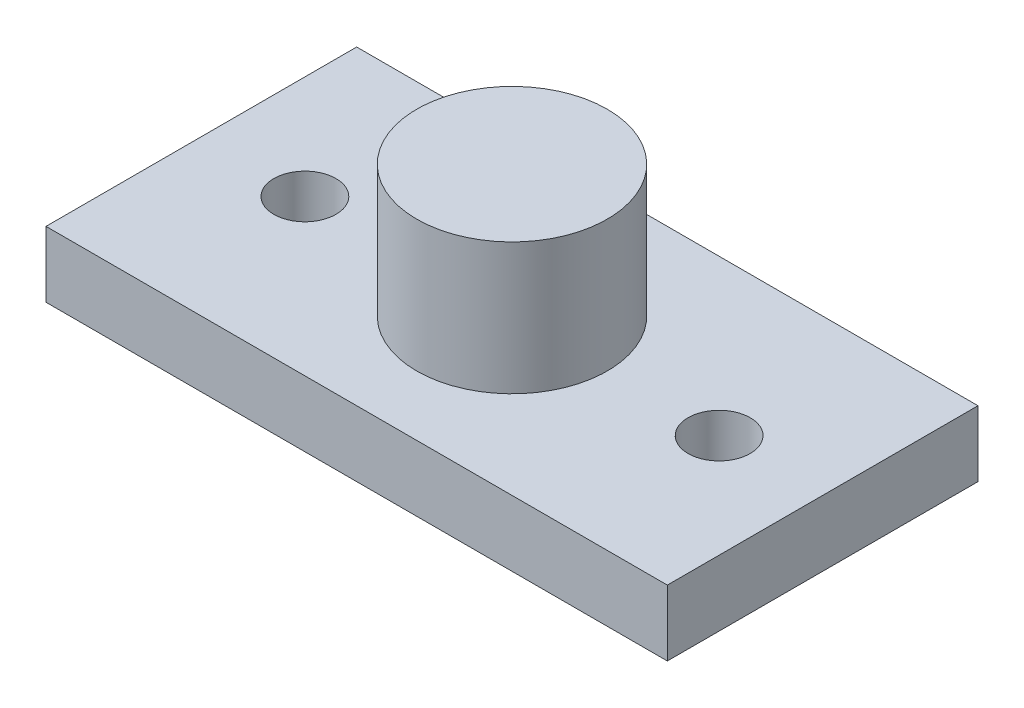
ISO-10303-21;
HEADER;
FILE_DESCRIPTION(('STEP AP214'),'2;1');
FILE_NAME('part.step','',(''),(''),'','','');
FILE_SCHEMA(('AUTOMOTIVE_DESIGN { 1 0 10303 214 1 1 1 1 }'));
ENDSEC;
DATA;
#1=APPLICATION_CONTEXT('core data for automotive mechanical design processes');
#2=APPLICATION_PROTOCOL_DEFINITION('international standard','automotive_design',2000,#1);
#3=PRODUCT_CONTEXT('',#1,'mechanical');
#4=PRODUCT('Part','Part','',(#3));
#5=PRODUCT_RELATED_PRODUCT_CATEGORY('part','',(#4));
#6=PRODUCT_DEFINITION_FORMATION('','',#4);
#7=PRODUCT_DEFINITION_CONTEXT('part definition',#1,'design');
#8=PRODUCT_DEFINITION('design','',#6,#7);
#9=PRODUCT_DEFINITION_SHAPE('','',#8);
#10=(LENGTH_UNIT() NAMED_UNIT(*) SI_UNIT(.MILLI.,.METRE.));
#11=(NAMED_UNIT(*) PLANE_ANGLE_UNIT() SI_UNIT($,.RADIAN.));
#12=(NAMED_UNIT(*) SI_UNIT($,.STERADIAN.) SOLID_ANGLE_UNIT());
#13=UNCERTAINTY_MEASURE_WITH_UNIT(LENGTH_MEASURE(1.E-05),#10,'distance_accuracy_value','');
#14=(GEOMETRIC_REPRESENTATION_CONTEXT(3) GLOBAL_UNCERTAINTY_ASSIGNED_CONTEXT((#13)) GLOBAL_UNIT_ASSIGNED_CONTEXT((#10,
#11,#12)) REPRESENTATION_CONTEXT('',''));
#15=CARTESIAN_POINT('',(0.,0.,0.));
#16=DIRECTION('',(0.,0.,1.));
#17=DIRECTION('',(1.,0.,0.));
#18=AXIS2_PLACEMENT_3D('',#15,#16,#17);
#19=CARTESIAN_POINT('',(15.,9.525,-7.5));
#20=DIRECTION('',(0.,-1.,0.));
#21=DIRECTION('',(0.,0.,-1.));
#22=AXIS2_PLACEMENT_3D('',#19,#20,#21);
#23=CYLINDRICAL_SURFACE('',#22,4.6);
#24=CARTESIAN_POINT('',(15.,3.175,-7.5));
#25=DIRECTION('',(0.,1.,0.));
#26=DIRECTION('',(0.,0.,1.));
#27=AXIS2_PLACEMENT_3D('',#24,#25,#26);
#28=CIRCLE('',#27,4.6);
#29=CARTESIAN_POINT('',(15.,3.175,-12.1));
#30=VERTEX_POINT('',#29);
#31=EDGE_CURVE('E142',#30,#30,#28,.T.);
#32=CARTESIAN_POINT('',(15.,9.525,-7.5));
#33=DIRECTION('',(0.,1.,0.));
#34=DIRECTION('',(0.,0.,1.));
#35=AXIS2_PLACEMENT_3D('',#32,#33,#34);
#36=CIRCLE('',#35,4.6);
#37=CARTESIAN_POINT('',(15.,9.525,-12.1));
#38=VERTEX_POINT('',#37);
#39=EDGE_CURVE('E11',#38,#38,#36,.T.);
#40=CARTESIAN_POINT('',(15.,3.175,-12.1));
#41=CARTESIAN_POINT('',(15.,3.24114583333333,-12.1));
#42=CARTESIAN_POINT('',(15.,3.30729166666667,-12.1));
#43=CARTESIAN_POINT('',(15.,3.43958333333333,-12.1));
#44=CARTESIAN_POINT('',(15.,3.50572916666667,-12.1));
#45=CARTESIAN_POINT('',(15.,3.63802083333333,-12.1));
#46=CARTESIAN_POINT('',(15.,3.70416666666667,-12.1));
#47=CARTESIAN_POINT('',(15.,3.83645833333333,-12.1));
#48=CARTESIAN_POINT('',(15.,3.90260416666667,-12.1));
#49=CARTESIAN_POINT('',(15.,4.03489583333333,-12.1));
#50=CARTESIAN_POINT('',(15.,4.10104166666667,-12.1));
#51=CARTESIAN_POINT('',(15.,4.23333333333333,-12.1));
#52=CARTESIAN_POINT('',(15.,4.29947916666667,-12.1));
#53=CARTESIAN_POINT('',(15.,4.43177083333333,-12.1));
#54=CARTESIAN_POINT('',(15.,4.49791666666667,-12.1));
#55=CARTESIAN_POINT('',(15.,4.63020833333333,-12.1));
#56=CARTESIAN_POINT('',(15.,4.69635416666667,-12.1));
#57=CARTESIAN_POINT('',(15.,4.82864583333333,-12.1));
#58=CARTESIAN_POINT('',(15.,4.89479166666667,-12.1));
#59=CARTESIAN_POINT('',(15.,5.02708333333333,-12.1));
#60=CARTESIAN_POINT('',(15.,5.09322916666667,-12.1));
#61=CARTESIAN_POINT('',(15.,5.22552083333333,-12.1));
#62=CARTESIAN_POINT('',(15.,5.29166666666667,-12.1));
#63=CARTESIAN_POINT('',(15.,5.42395833333333,-12.1));
#64=CARTESIAN_POINT('',(15.,5.49010416666667,-12.1));
#65=CARTESIAN_POINT('',(15.,5.62239583333333,-12.1));
#66=CARTESIAN_POINT('',(15.,5.68854166666667,-12.1));
#67=CARTESIAN_POINT('',(15.,5.82083333333333,-12.1));
#68=CARTESIAN_POINT('',(15.,5.88697916666667,-12.1));
#69=CARTESIAN_POINT('',(15.,6.01927083333333,-12.1));
#70=CARTESIAN_POINT('',(15.,6.08541666666667,-12.1));
#71=CARTESIAN_POINT('',(15.,6.21770833333333,-12.1));
#72=CARTESIAN_POINT('',(15.,6.28385416666667,-12.1));
#73=CARTESIAN_POINT('',(15.,6.41614583333333,-12.1));
#74=CARTESIAN_POINT('',(15.,6.48229166666667,-12.1));
#75=CARTESIAN_POINT('',(15.,6.61458333333333,-12.1));
#76=CARTESIAN_POINT('',(15.,6.68072916666667,-12.1));
#77=CARTESIAN_POINT('',(15.,6.81302083333333,-12.1));
#78=CARTESIAN_POINT('',(15.,6.87916666666667,-12.1));
#79=CARTESIAN_POINT('',(15.,7.01145833333333,-12.1));
#80=CARTESIAN_POINT('',(15.,7.07760416666667,-12.1));
#81=CARTESIAN_POINT('',(15.,7.20989583333333,-12.1));
#82=CARTESIAN_POINT('',(15.,7.27604166666667,-12.1));
#83=CARTESIAN_POINT('',(15.,7.40833333333333,-12.1));
#84=CARTESIAN_POINT('',(15.,7.47447916666667,-12.1));
#85=CARTESIAN_POINT('',(15.,7.60677083333333,-12.1));
#86=CARTESIAN_POINT('',(15.,7.67291666666667,-12.1));
#87=CARTESIAN_POINT('',(15.,7.80520833333333,-12.1));
#88=CARTESIAN_POINT('',(15.,7.87135416666667,-12.1));
#89=CARTESIAN_POINT('',(15.,8.00364583333333,-12.1));
#90=CARTESIAN_POINT('',(15.,8.06979166666667,-12.1));
#91=CARTESIAN_POINT('',(15.,8.20208333333333,-12.1));
#92=CARTESIAN_POINT('',(15.,8.26822916666667,-12.1));
#93=CARTESIAN_POINT('',(15.,8.40052083333333,-12.1));
#94=CARTESIAN_POINT('',(15.,8.46666666666667,-12.1));
#95=CARTESIAN_POINT('',(15.,8.59895833333333,-12.1));
#96=CARTESIAN_POINT('',(15.,8.66510416666667,-12.1));
#97=CARTESIAN_POINT('',(15.,8.79739583333333,-12.1));
#98=CARTESIAN_POINT('',(15.,8.86354166666667,-12.1));
#99=CARTESIAN_POINT('',(15.,8.99583333333333,-12.1));
#100=CARTESIAN_POINT('',(15.,9.06197916666667,-12.1));
#101=CARTESIAN_POINT('',(15.,9.19427083333333,-12.1));
#102=CARTESIAN_POINT('',(15.,9.26041666666667,-12.1));
#103=CARTESIAN_POINT('',(15.,9.39270833333333,-12.1));
#104=CARTESIAN_POINT('',(15.,9.45885416666667,-12.1));
#105=CARTESIAN_POINT('',(15.,9.525,-12.1));
#106=B_SPLINE_CURVE_WITH_KNOTS('',3,(#40,#41,#42,#43,#44,#45,#46,#47,#48,#49,#50,#51,#52,#53,
#54,#55,#56,#57,#58,#59,#60,#61,#62,#63,#64,#65,#66,#67,#68,#69,#70,#71,#72,#73,#74,#75,#76,#77,
#78,#79,#80,#81,#82,#83,#84,#85,#86,#87,#88,#89,#90,#91,#92,#93,#94,#95,#96,#97,#98,#99,#100,
#101,#102,#103,#104,#105),.UNSPECIFIED.,.F.,.F.,(4,2,2,2,2,2,2,2,2,2,2,2,2,2,2,2,2,2,2,2,2,2,2,
2,2,2,2,2,2,2,2,2,4),(0.,0.1984375,0.396875,0.5953125,0.79375,0.9921875,1.190625,1.3890625,
1.5875,1.7859375,1.984375,2.1828125,2.38125,2.5796875,2.778125,2.9765625,3.175,3.3734375,
3.571875,3.7703125,3.96875,4.1671875,4.365625,4.5640625,4.7625,4.9609375,5.159375,5.3578125,
5.55625,5.7546875,5.953125,6.1515625,6.35),.UNSPECIFIED.);
#107=EDGE_CURVE('BSEAM32',#30,#38,#106,.T.);
#108=ORIENTED_EDGE('',*,*,#31,.T.);
#109=ORIENTED_EDGE('',*,*,#39,.F.);
#110=ORIENTED_EDGE('',*,*,#107,.T.);
#111=ORIENTED_EDGE('',*,*,#107,.F.);
#112=EDGE_LOOP('',(#108,#110,#109,#111));
#113=FACE_BOUND('',#112,.T.);
#114=ADVANCED_FACE('F32',(#113),#23,.T.);
#115=CARTESIAN_POINT('',(0.,9.525,0.));
#116=DIRECTION('',(0.,1.,0.));
#117=DIRECTION('',(0.,0.,1.));
#118=AXIS2_PLACEMENT_3D('',#115,#116,#117);
#119=PLANE('',#118);
#120=ORIENTED_EDGE('',*,*,#39,.T.);
#121=EDGE_LOOP('',(#120));
#122=FACE_BOUND('',#121,.T.);
#123=ADVANCED_FACE('F132',(#122),#119,.T.);
#124=CARTESIAN_POINT('',(0.,3.175,0.));
#125=DIRECTION('',(0.,0.,-1.));
#126=DIRECTION('',(-1.,0.,0.));
#127=AXIS2_PLACEMENT_3D('',#124,#125,#126);
#128=PLANE('',#127);
#129=DIRECTION('',(1.,0.,0.));
#130=VECTOR('',#129,1.);
#131=CARTESIAN_POINT('',(0.,0.,0.));
#132=LINE('',#131,#130);
#133=CARTESIAN_POINT('',(0.,0.,0.));
#134=VERTEX_POINT('',#133);
#135=CARTESIAN_POINT('',(30.,0.,0.));
#136=VERTEX_POINT('',#135);
#137=EDGE_CURVE('E104',#134,#136,#132,.T.);
#138=ORIENTED_EDGE('',*,*,#137,.T.);
#139=DIRECTION('',(0.,-1.,0.));
#140=VECTOR('',#139,1.);
#141=CARTESIAN_POINT('',(30.,3.175,0.));
#142=LINE('',#141,#140);
#143=CARTESIAN_POINT('',(30.,3.175,0.));
#144=VERTEX_POINT('',#143);
#145=EDGE_CURVE('E40',#144,#136,#142,.T.);
#146=ORIENTED_EDGE('',*,*,#145,.F.);
#147=DIRECTION('',(1.,0.,0.));
#148=VECTOR('',#147,1.);
#149=CARTESIAN_POINT('',(0.,3.175,0.));
#150=LINE('',#149,#148);
#151=CARTESIAN_POINT('',(0.,3.175,0.));
#152=VERTEX_POINT('',#151);
#153=EDGE_CURVE('E82',#152,#144,#150,.T.);
#154=ORIENTED_EDGE('',*,*,#153,.F.);
#155=DIRECTION('',(0.,-1.,0.));
#156=VECTOR('',#155,1.);
#157=CARTESIAN_POINT('',(0.,3.175,0.));
#158=LINE('',#157,#156);
#159=EDGE_CURVE('E48',#152,#134,#158,.T.);
#160=ORIENTED_EDGE('',*,*,#159,.T.);
#161=EDGE_LOOP('',(#138,#146,#154,#160));
#162=FACE_BOUND('',#161,.T.);
#163=ADVANCED_FACE('F114',(#162),#128,.F.);
#164=CARTESIAN_POINT('',(30.,3.175,0.));
#165=DIRECTION('',(-1.,0.,0.));
#166=DIRECTION('',(0.,0.,1.));
#167=AXIS2_PLACEMENT_3D('',#164,#165,#166);
#168=PLANE('',#167);
#169=DIRECTION('',(0.,0.,-1.));
#170=VECTOR('',#169,1.);
#171=CARTESIAN_POINT('',(30.,0.,0.));
#172=LINE('',#171,#170);
#173=CARTESIAN_POINT('',(30.,0.,-15.));
#174=VERTEX_POINT('',#173);
#175=EDGE_CURVE('E88',#136,#174,#172,.T.);
#176=ORIENTED_EDGE('',*,*,#175,.T.);
#177=DIRECTION('',(0.,-1.,0.));
#178=VECTOR('',#177,1.);
#179=CARTESIAN_POINT('',(30.,3.175,-15.));
#180=LINE('',#179,#178);
#181=CARTESIAN_POINT('',(30.,3.175,-15.));
#182=VERTEX_POINT('',#181);
#183=EDGE_CURVE('E86',#182,#174,#180,.T.);
#184=ORIENTED_EDGE('',*,*,#183,.F.);
#185=DIRECTION('',(0.,0.,-1.));
#186=VECTOR('',#185,1.);
#187=CARTESIAN_POINT('',(30.,3.175,0.));
#188=LINE('',#187,#186);
#189=EDGE_CURVE('E74',#144,#182,#188,.T.);
#190=ORIENTED_EDGE('',*,*,#189,.F.);
#191=ORIENTED_EDGE('',*,*,#145,.T.);
#192=EDGE_LOOP('',(#176,#184,#190,#191));
#193=FACE_BOUND('',#192,.T.);
#194=ADVANCED_FACE('F87',(#193),#168,.F.);
#195=CARTESIAN_POINT('',(0.,3.175,-15.));
#196=DIRECTION('',(0.,0.,-1.));
#197=DIRECTION('',(-1.,0.,0.));
#198=AXIS2_PLACEMENT_3D('',#195,#196,#197);
#199=PLANE('',#198);
#200=DIRECTION('',(1.,0.,0.));
#201=VECTOR('',#200,1.);
#202=CARTESIAN_POINT('',(0.,0.,-15.));
#203=LINE('',#202,#201);
#204=CARTESIAN_POINT('',(0.,0.,-15.));
#205=VERTEX_POINT('',#204);
#206=EDGE_CURVE('E107',#205,#174,#203,.T.);
#207=ORIENTED_EDGE('',*,*,#206,.F.);
#208=DIRECTION('',(0.,-1.,0.));
#209=VECTOR('',#208,1.);
#210=CARTESIAN_POINT('',(0.,3.175,-15.));
#211=LINE('',#210,#209);
#212=CARTESIAN_POINT('',(0.,3.175,-15.));
#213=VERTEX_POINT('',#212);
#214=EDGE_CURVE('E62',#213,#205,#211,.T.);
#215=ORIENTED_EDGE('',*,*,#214,.F.);
#216=DIRECTION('',(1.,0.,0.));
#217=VECTOR('',#216,1.);
#218=CARTESIAN_POINT('',(0.,3.175,-15.));
#219=LINE('',#218,#217);
#220=EDGE_CURVE('E81',#213,#182,#219,.T.);
#221=ORIENTED_EDGE('',*,*,#220,.T.);
#222=ORIENTED_EDGE('',*,*,#183,.T.);
#223=EDGE_LOOP('',(#207,#215,#221,#222));
#224=FACE_BOUND('',#223,.T.);
#225=ADVANCED_FACE('F92',(#224),#199,.T.);
#226=CARTESIAN_POINT('',(25.,3.175,-7.5));
#227=DIRECTION('',(0.,-1.,0.));
#228=DIRECTION('',(0.,0.,-1.));
#229=AXIS2_PLACEMENT_3D('',#226,#227,#228);
#230=CYLINDRICAL_SURFACE('',#229,1.5);
#231=CARTESIAN_POINT('',(25.,3.175,-7.5));
#232=DIRECTION('',(0.,1.,0.));
#233=DIRECTION('',(0.,0.,1.));
#234=AXIS2_PLACEMENT_3D('',#231,#232,#233);
#235=CIRCLE('',#234,1.5);
#236=CARTESIAN_POINT('',(25.,3.175,-6.));
#237=VERTEX_POINT('',#236);
#238=EDGE_CURVE('E145',#237,#237,#235,.T.);
#239=ORIENTED_EDGE('',*,*,#238,.T.);
#240=EDGE_LOOP('',(#239));
#241=FACE_BOUND('',#240,.T.);
#242=CARTESIAN_POINT('',(25.,0.,-7.5));
#243=DIRECTION('',(0.,1.,0.));
#244=DIRECTION('',(0.,0.,1.));
#245=AXIS2_PLACEMENT_3D('',#242,#243,#244);
#246=CIRCLE('',#245,1.5);
#247=CARTESIAN_POINT('',(25.,0.,-6.));
#248=VERTEX_POINT('',#247);
#249=EDGE_CURVE('E101',#248,#248,#246,.T.);
#250=ORIENTED_EDGE('',*,*,#249,.F.);
#251=EDGE_LOOP('',(#250));
#252=FACE_BOUND('',#251,.T.);
#253=ADVANCED_FACE('F127',(#241,#252),#230,.F.);
#254=CARTESIAN_POINT('',(5.,3.175,-7.5));
#255=DIRECTION('',(0.,-1.,0.));
#256=DIRECTION('',(0.,0.,-1.));
#257=AXIS2_PLACEMENT_3D('',#254,#255,#256);
#258=CYLINDRICAL_SURFACE('',#257,1.5);
#259=CARTESIAN_POINT('',(5.,3.175,-7.5));
#260=DIRECTION('',(0.,1.,0.));
#261=DIRECTION('',(0.,0.,1.));
#262=AXIS2_PLACEMENT_3D('',#259,#260,#261);
#263=CIRCLE('',#262,1.5);
#264=CARTESIAN_POINT('',(5.,3.175,-6.));
#265=VERTEX_POINT('',#264);
#266=EDGE_CURVE('E112',#265,#265,#263,.T.);
#267=ORIENTED_EDGE('',*,*,#266,.T.);
#268=EDGE_LOOP('',(#267));
#269=FACE_BOUND('',#268,.T.);
#270=CARTESIAN_POINT('',(5.,0.,-7.5));
#271=DIRECTION('',(0.,1.,0.));
#272=DIRECTION('',(0.,0.,1.));
#273=AXIS2_PLACEMENT_3D('',#270,#271,#272);
#274=CIRCLE('',#273,1.5);
#275=CARTESIAN_POINT('',(5.,0.,-6.));
#276=VERTEX_POINT('',#275);
#277=EDGE_CURVE('E98',#276,#276,#274,.T.);
#278=ORIENTED_EDGE('',*,*,#277,.F.);
#279=EDGE_LOOP('',(#278));
#280=FACE_BOUND('',#279,.T.);
#281=ADVANCED_FACE('F119',(#269,#280),#258,.F.);
#282=CARTESIAN_POINT('',(0.,3.175,0.));
#283=DIRECTION('',(-1.,0.,0.));
#284=DIRECTION('',(0.,0.,1.));
#285=AXIS2_PLACEMENT_3D('',#282,#283,#284);
#286=PLANE('',#285);
#287=DIRECTION('',(0.,0.,-1.));
#288=VECTOR('',#287,1.);
#289=CARTESIAN_POINT('',(0.,0.,0.));
#290=LINE('',#289,#288);
#291=EDGE_CURVE('E109',#134,#205,#290,.T.);
#292=ORIENTED_EDGE('',*,*,#291,.F.);
#293=ORIENTED_EDGE('',*,*,#159,.F.);
#294=DIRECTION('',(0.,0.,-1.));
#295=VECTOR('',#294,1.);
#296=CARTESIAN_POINT('',(0.,3.175,0.));
#297=LINE('',#296,#295);
#298=EDGE_CURVE('E93',#152,#213,#297,.T.);
#299=ORIENTED_EDGE('',*,*,#298,.T.);
#300=ORIENTED_EDGE('',*,*,#214,.T.);
#301=EDGE_LOOP('',(#292,#293,#299,#300));
#302=FACE_BOUND('',#301,.T.);
#303=ADVANCED_FACE('F117',(#302),#286,.T.);
#304=CARTESIAN_POINT('',(0.,3.175,0.));
#305=DIRECTION('',(0.,1.,0.));
#306=DIRECTION('',(0.,0.,1.));
#307=AXIS2_PLACEMENT_3D('',#304,#305,#306);
#308=PLANE('',#307);
#309=ORIENTED_EDGE('',*,*,#266,.F.);
#310=EDGE_LOOP('',(#309));
#311=FACE_BOUND('',#310,.T.);
#312=ORIENTED_EDGE('',*,*,#238,.F.);
#313=EDGE_LOOP('',(#312));
#314=FACE_BOUND('',#313,.T.);
#315=ORIENTED_EDGE('',*,*,#31,.F.);
#316=EDGE_LOOP('',(#315));
#317=FACE_BOUND('',#316,.T.);
#318=ORIENTED_EDGE('',*,*,#153,.T.);
#319=ORIENTED_EDGE('',*,*,#189,.T.);
#320=ORIENTED_EDGE('',*,*,#220,.F.);
#321=ORIENTED_EDGE('',*,*,#298,.F.);
#322=EDGE_LOOP('',(#318,#319,#320,#321));
#323=FACE_BOUND('',#322,.T.);
#324=ADVANCED_FACE('F78',(#311,#314,#317,#323),#308,.T.);
#325=CARTESIAN_POINT('',(0.,0.,0.));
#326=DIRECTION('',(0.,1.,0.));
#327=DIRECTION('',(0.,0.,1.));
#328=AXIS2_PLACEMENT_3D('',#325,#326,#327);
#329=PLANE('',#328);
#330=ORIENTED_EDGE('',*,*,#277,.T.);
#331=EDGE_LOOP('',(#330));
#332=FACE_BOUND('',#331,.T.);
#333=ORIENTED_EDGE('',*,*,#249,.T.);
#334=EDGE_LOOP('',(#333));
#335=FACE_BOUND('',#334,.T.);
#336=ORIENTED_EDGE('',*,*,#137,.F.);
#337=ORIENTED_EDGE('',*,*,#291,.T.);
#338=ORIENTED_EDGE('',*,*,#206,.T.);
#339=ORIENTED_EDGE('',*,*,#175,.F.);
#340=EDGE_LOOP('',(#336,#337,#338,#339));
#341=FACE_BOUND('',#340,.T.);
#342=ADVANCED_FACE('F116',(#332,#335,#341),#329,.F.);
#343=CLOSED_SHELL('',(#114,#123,#163,#194,#225,#253,#281,#303,#324,#342));
#344=MANIFOLD_SOLID_BREP('B2',#343);
#345=ADVANCED_BREP_SHAPE_REPRESENTATION('',(#18,#344),#14);
#346=SHAPE_DEFINITION_REPRESENTATION(#9,#345);
ENDSEC;
END-ISO-10303-21;
